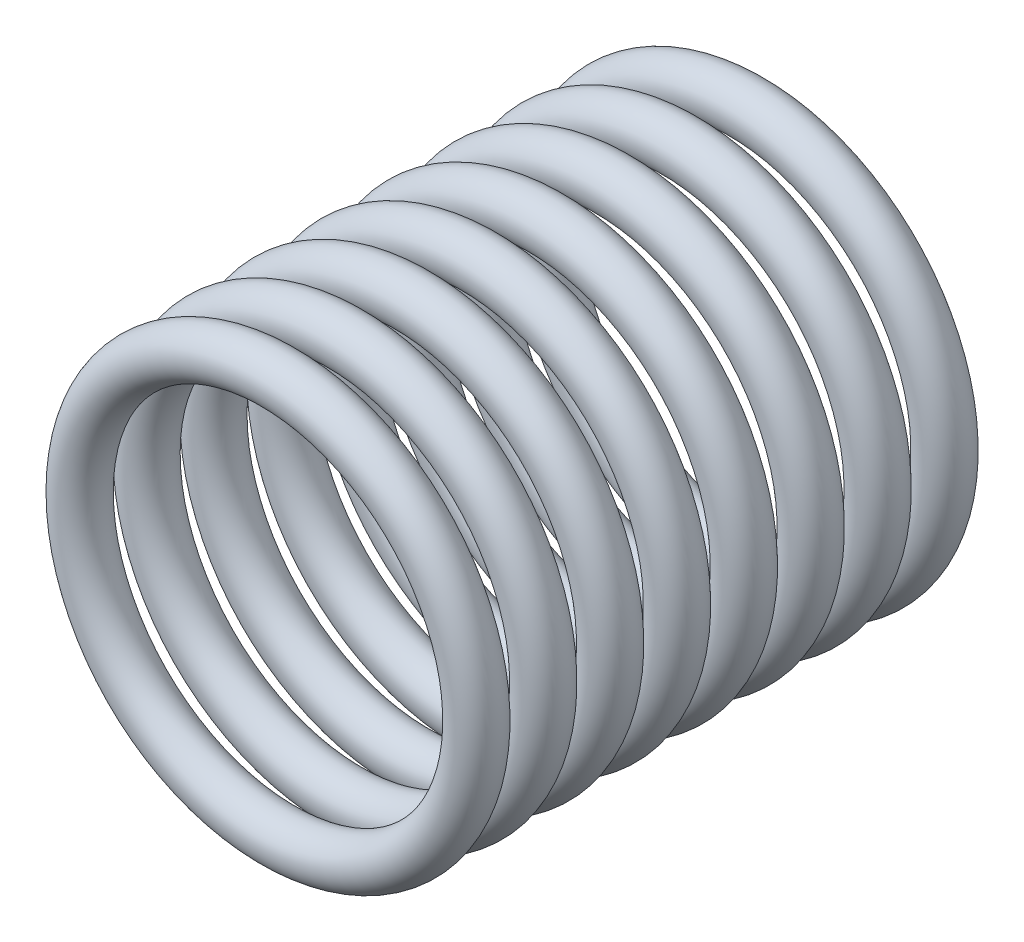
ISO-10303-21;
HEADER;
FILE_DESCRIPTION(('STEP AP214'),'2;1');
FILE_NAME('part.step','',(''),(''),'','','');
FILE_SCHEMA(('AUTOMOTIVE_DESIGN { 1 0 10303 214 1 1 1 1 }'));
ENDSEC;
DATA;
#1=APPLICATION_CONTEXT('core data for automotive mechanical design processes');
#2=APPLICATION_PROTOCOL_DEFINITION('international standard','automotive_design',2000,#1);
#3=PRODUCT_CONTEXT('',#1,'mechanical');
#4=PRODUCT('Part','Part','',(#3));
#5=PRODUCT_RELATED_PRODUCT_CATEGORY('part','',(#4));
#6=PRODUCT_DEFINITION_FORMATION('','',#4);
#7=PRODUCT_DEFINITION_CONTEXT('part definition',#1,'design');
#8=PRODUCT_DEFINITION('design','',#6,#7);
#9=PRODUCT_DEFINITION_SHAPE('','',#8);
#10=(LENGTH_UNIT() NAMED_UNIT(*) SI_UNIT(.MILLI.,.METRE.));
#11=(NAMED_UNIT(*) PLANE_ANGLE_UNIT() SI_UNIT($,.RADIAN.));
#12=(NAMED_UNIT(*) SI_UNIT($,.STERADIAN.) SOLID_ANGLE_UNIT());
#13=UNCERTAINTY_MEASURE_WITH_UNIT(LENGTH_MEASURE(1.E-05),#10,'distance_accuracy_value','');
#14=(GEOMETRIC_REPRESENTATION_CONTEXT(3) GLOBAL_UNCERTAINTY_ASSIGNED_CONTEXT((#13)) GLOBAL_UNIT_ASSIGNED_CONTEXT((#10,
#11,#12)) REPRESENTATION_CONTEXT('',''));
#15=CARTESIAN_POINT('',(0.,0.,0.));
#16=DIRECTION('',(0.,0.,1.));
#17=DIRECTION('',(1.,0.,0.));
#18=AXIS2_PLACEMENT_3D('',#15,#16,#17);
#19=CARTESIAN_POINT('',(0.,0.,12.4));
#20=DIRECTION('',(0.,0.,-1.));
#21=DIRECTION('',(-1.,0.,0.));
#22=AXIS2_PLACEMENT_3D('',#19,#20,#21);
#23=TOROIDAL_SURFACE('',#22,5.,0.6);
#24=CARTESIAN_POINT('',(-5.6,0.,12.4));
#25=VERTEX_POINT('',#24);
#26=VERTEX_LOOP('',#25);
#27=FACE_BOUND('',#26,.T.);
#28=ADVANCED_FACE('F44',(#27),#23,.T.);
#29=CLOSED_SHELL('',(#28));
#30=MANIFOLD_SOLID_BREP('B2',#29);
#31=CARTESIAN_POINT('',(0.,0.,10.7143));
#32=DIRECTION('',(0.,0.,-1.));
#33=DIRECTION('',(-1.,0.,0.));
#34=AXIS2_PLACEMENT_3D('',#31,#32,#33);
#35=TOROIDAL_SURFACE('',#34,5.,0.6);
#36=CARTESIAN_POINT('',(-5.6,0.,10.7143));
#37=VERTEX_POINT('',#36);
#38=VERTEX_LOOP('',#37);
#39=FACE_BOUND('',#38,.T.);
#40=ADVANCED_FACE('F63',(#39),#35,.T.);
#41=CLOSED_SHELL('',(#40));
#42=MANIFOLD_SOLID_BREP('B6',#41);
#43=CARTESIAN_POINT('',(0.,0.,9.0286));
#44=DIRECTION('',(0.,0.,-1.));
#45=DIRECTION('',(-1.,0.,0.));
#46=AXIS2_PLACEMENT_3D('',#43,#44,#45);
#47=TOROIDAL_SURFACE('',#46,5.,0.6);
#48=CARTESIAN_POINT('',(-5.6,0.,9.0286));
#49=VERTEX_POINT('',#48);
#50=VERTEX_LOOP('',#49);
#51=FACE_BOUND('',#50,.T.);
#52=ADVANCED_FACE('F82',(#51),#47,.T.);
#53=CLOSED_SHELL('',(#52));
#54=MANIFOLD_SOLID_BREP('B40',#53);
#55=CARTESIAN_POINT('',(0.,0.,7.3429));
#56=DIRECTION('',(0.,0.,-1.));
#57=DIRECTION('',(-1.,0.,0.));
#58=AXIS2_PLACEMENT_3D('',#55,#56,#57);
#59=TOROIDAL_SURFACE('',#58,5.,0.6);
#60=CARTESIAN_POINT('',(-5.6,0.,7.3429));
#61=VERTEX_POINT('',#60);
#62=VERTEX_LOOP('',#61);
#63=FACE_BOUND('',#62,.T.);
#64=ADVANCED_FACE('F101',(#63),#59,.T.);
#65=CLOSED_SHELL('',(#64));
#66=MANIFOLD_SOLID_BREP('B59',#65);
#67=CARTESIAN_POINT('',(0.,0.,5.6571));
#68=DIRECTION('',(0.,0.,-1.));
#69=DIRECTION('',(-1.,0.,0.));
#70=AXIS2_PLACEMENT_3D('',#67,#68,#69);
#71=TOROIDAL_SURFACE('',#70,5.,0.6);
#72=CARTESIAN_POINT('',(-5.6,0.,5.6571));
#73=VERTEX_POINT('',#72);
#74=VERTEX_LOOP('',#73);
#75=FACE_BOUND('',#74,.T.);
#76=ADVANCED_FACE('F120',(#75),#71,.T.);
#77=CLOSED_SHELL('',(#76));
#78=MANIFOLD_SOLID_BREP('B78',#77);
#79=CARTESIAN_POINT('',(0.,0.,3.9714));
#80=DIRECTION('',(0.,0.,-1.));
#81=DIRECTION('',(-1.,0.,0.));
#82=AXIS2_PLACEMENT_3D('',#79,#80,#81);
#83=TOROIDAL_SURFACE('',#82,5.,0.6);
#84=CARTESIAN_POINT('',(-5.6,0.,3.9714));
#85=VERTEX_POINT('',#84);
#86=VERTEX_LOOP('',#85);
#87=FACE_BOUND('',#86,.T.);
#88=ADVANCED_FACE('F139',(#87),#83,.T.);
#89=CLOSED_SHELL('',(#88));
#90=MANIFOLD_SOLID_BREP('B97',#89);
#91=CARTESIAN_POINT('',(0.,0.,2.2857));
#92=DIRECTION('',(0.,0.,-1.));
#93=DIRECTION('',(-1.,0.,0.));
#94=AXIS2_PLACEMENT_3D('',#91,#92,#93);
#95=TOROIDAL_SURFACE('',#94,5.,0.6);
#96=CARTESIAN_POINT('',(-5.6,0.,2.2857));
#97=VERTEX_POINT('',#96);
#98=VERTEX_LOOP('',#97);
#99=FACE_BOUND('',#98,.T.);
#100=ADVANCED_FACE('F157',(#99),#95,.T.);
#101=CLOSED_SHELL('',(#100));
#102=MANIFOLD_SOLID_BREP('B116',#101);
#103=CARTESIAN_POINT('',(0.,0.,0.6));
#104=DIRECTION('',(0.,0.,-1.));
#105=DIRECTION('',(-1.,0.,0.));
#106=AXIS2_PLACEMENT_3D('',#103,#104,#105);
#107=TOROIDAL_SURFACE('',#106,5.,0.6);
#108=CARTESIAN_POINT('',(-5.6,0.,0.6));
#109=VERTEX_POINT('',#108);
#110=VERTEX_LOOP('',#109);
#111=FACE_BOUND('',#110,.T.);
#112=ADVANCED_FACE('F170',(#111),#107,.T.);
#113=CLOSED_SHELL('',(#112));
#114=MANIFOLD_SOLID_BREP('B135',#113);
#115=ADVANCED_BREP_SHAPE_REPRESENTATION('',(#18,#30,#42,#54,#66,#78,#90,#102,#114),#14);
#116=SHAPE_DEFINITION_REPRESENTATION(#9,#115);
ENDSEC;
END-ISO-10303-21;
